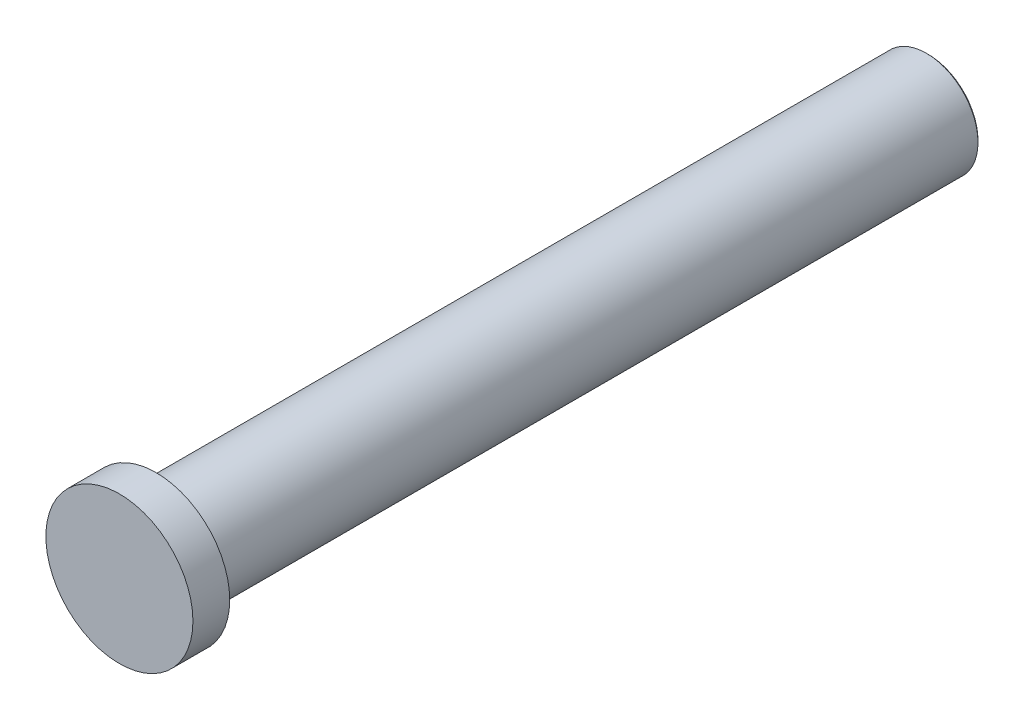
ISO-10303-21;
HEADER;
FILE_DESCRIPTION(('STEP AP214'),'2;1');
FILE_NAME('part.step','',(''),(''),'','','');
FILE_SCHEMA(('AUTOMOTIVE_DESIGN { 1 0 10303 214 1 1 1 1 }'));
ENDSEC;
DATA;
#1=APPLICATION_CONTEXT('core data for automotive mechanical design processes');
#2=APPLICATION_PROTOCOL_DEFINITION('international standard','automotive_design',2000,#1);
#3=PRODUCT_CONTEXT('',#1,'mechanical');
#4=PRODUCT('Part','Part','',(#3));
#5=PRODUCT_RELATED_PRODUCT_CATEGORY('part','',(#4));
#6=PRODUCT_DEFINITION_FORMATION('','',#4);
#7=PRODUCT_DEFINITION_CONTEXT('part definition',#1,'design');
#8=PRODUCT_DEFINITION('design','',#6,#7);
#9=PRODUCT_DEFINITION_SHAPE('','',#8);
#10=(LENGTH_UNIT() NAMED_UNIT(*) SI_UNIT(.MILLI.,.METRE.));
#11=(NAMED_UNIT(*) PLANE_ANGLE_UNIT() SI_UNIT($,.RADIAN.));
#12=(NAMED_UNIT(*) SI_UNIT($,.STERADIAN.) SOLID_ANGLE_UNIT());
#13=UNCERTAINTY_MEASURE_WITH_UNIT(LENGTH_MEASURE(1.E-05),#10,'distance_accuracy_value','');
#14=(GEOMETRIC_REPRESENTATION_CONTEXT(3) GLOBAL_UNCERTAINTY_ASSIGNED_CONTEXT((#13)) GLOBAL_UNIT_ASSIGNED_CONTEXT((#10,
#11,#12)) REPRESENTATION_CONTEXT('',''));
#15=CARTESIAN_POINT('',(0.,0.,0.));
#16=DIRECTION('',(0.,0.,1.));
#17=DIRECTION('',(1.,0.,0.));
#18=AXIS2_PLACEMENT_3D('',#15,#16,#17);
#19=CARTESIAN_POINT('',(0.,0.,21.));
#20=DIRECTION('',(0.,0.,-1.));
#21=DIRECTION('',(-1.,0.,0.));
#22=AXIS2_PLACEMENT_3D('',#19,#20,#21);
#23=CYLINDRICAL_SURFACE('',#22,1.4);
#24=CARTESIAN_POINT('',(0.,0.,20.95));
#25=DIRECTION('',(0.,0.,1.));
#26=DIRECTION('',(1.,0.,0.));
#27=AXIS2_PLACEMENT_3D('',#24,#25,#26);
#28=CIRCLE('',#27,1.4);
#29=CARTESIAN_POINT('',(-1.4,0.,20.95));
#30=VERTEX_POINT('',#29);
#31=EDGE_CURVE('E54',#30,#30,#28,.F.);
#32=CARTESIAN_POINT('',(0.,0.,0.0500000000000153));
#33=DIRECTION('',(0.,0.,1.));
#34=DIRECTION('',(1.,0.,0.));
#35=AXIS2_PLACEMENT_3D('',#32,#33,#34);
#36=CIRCLE('',#35,1.4);
#37=CARTESIAN_POINT('',(-1.4,0.,0.0500000000000153));
#38=VERTEX_POINT('',#37);
#39=EDGE_CURVE('E59',#38,#38,#36,.T.);
#40=CARTESIAN_POINT('',(-1.4,0.,20.95));
#41=CARTESIAN_POINT('',(-1.4,0.,20.7322916666667));
#42=CARTESIAN_POINT('',(-1.4,0.,20.5145833333333));
#43=CARTESIAN_POINT('',(-1.4,0.,20.0791666666667));
#44=CARTESIAN_POINT('',(-1.4,0.,19.8614583333333));
#45=CARTESIAN_POINT('',(-1.4,0.,19.4260416666667));
#46=CARTESIAN_POINT('',(-1.4,0.,19.2083333333333));
#47=CARTESIAN_POINT('',(-1.4,0.,18.7729166666667));
#48=CARTESIAN_POINT('',(-1.4,0.,18.5552083333333));
#49=CARTESIAN_POINT('',(-1.4,0.,18.1197916666667));
#50=CARTESIAN_POINT('',(-1.4,0.,17.9020833333333));
#51=CARTESIAN_POINT('',(-1.4,0.,17.4666666666667));
#52=CARTESIAN_POINT('',(-1.4,0.,17.2489583333333));
#53=CARTESIAN_POINT('',(-1.4,0.,16.8135416666667));
#54=CARTESIAN_POINT('',(-1.4,0.,16.5958333333333));
#55=CARTESIAN_POINT('',(-1.4,0.,16.1604166666667));
#56=CARTESIAN_POINT('',(-1.4,0.,15.9427083333333));
#57=CARTESIAN_POINT('',(-1.4,0.,15.5072916666667));
#58=CARTESIAN_POINT('',(-1.4,0.,15.2895833333333));
#59=CARTESIAN_POINT('',(-1.4,0.,14.8541666666667));
#60=CARTESIAN_POINT('',(-1.4,0.,14.6364583333333));
#61=CARTESIAN_POINT('',(-1.4,0.,14.2010416666667));
#62=CARTESIAN_POINT('',(-1.4,0.,13.9833333333333));
#63=CARTESIAN_POINT('',(-1.4,0.,13.5479166666667));
#64=CARTESIAN_POINT('',(-1.4,0.,13.3302083333333));
#65=CARTESIAN_POINT('',(-1.4,0.,12.8947916666667));
#66=CARTESIAN_POINT('',(-1.4,0.,12.6770833333333));
#67=CARTESIAN_POINT('',(-1.4,0.,12.2416666666667));
#68=CARTESIAN_POINT('',(-1.4,0.,12.0239583333333));
#69=CARTESIAN_POINT('',(-1.4,0.,11.5885416666667));
#70=CARTESIAN_POINT('',(-1.4,0.,11.3708333333333));
#71=CARTESIAN_POINT('',(-1.4,0.,10.9354166666667));
#72=CARTESIAN_POINT('',(-1.4,0.,10.7177083333333));
#73=CARTESIAN_POINT('',(-1.4,0.,10.2822916666667));
#74=CARTESIAN_POINT('',(-1.4,0.,10.0645833333333));
#75=CARTESIAN_POINT('',(-1.4,0.,9.62916666666668));
#76=CARTESIAN_POINT('',(-1.4,0.,9.41145833333334));
#77=CARTESIAN_POINT('',(-1.4,0.,8.97604166666668));
#78=CARTESIAN_POINT('',(-1.4,0.,8.75833333333334));
#79=CARTESIAN_POINT('',(-1.4,0.,8.32291666666668));
#80=CARTESIAN_POINT('',(-1.4,0.,8.10520833333334));
#81=CARTESIAN_POINT('',(-1.4,0.,7.66979166666668));
#82=CARTESIAN_POINT('',(-1.4,0.,7.45208333333334));
#83=CARTESIAN_POINT('',(-1.4,0.,7.01666666666668));
#84=CARTESIAN_POINT('',(-1.4,0.,6.79895833333334));
#85=CARTESIAN_POINT('',(-1.4,0.,6.36354166666668));
#86=CARTESIAN_POINT('',(-1.4,0.,6.14583333333334));
#87=CARTESIAN_POINT('',(-1.4,0.,5.71041666666668));
#88=CARTESIAN_POINT('',(-1.4,0.,5.49270833333335));
#89=CARTESIAN_POINT('',(-1.4,0.,5.05729166666668));
#90=CARTESIAN_POINT('',(-1.4,0.,4.83958333333335));
#91=CARTESIAN_POINT('',(-1.4,0.,4.40416666666668));
#92=CARTESIAN_POINT('',(-1.4,0.,4.18645833333335));
#93=CARTESIAN_POINT('',(-1.4,0.,3.75104166666668));
#94=CARTESIAN_POINT('',(-1.4,0.,3.53333333333334));
#95=CARTESIAN_POINT('',(-1.4,0.,3.09791666666668));
#96=CARTESIAN_POINT('',(-1.4,0.,2.88020833333334));
#97=CARTESIAN_POINT('',(-1.4,0.,2.44479166666668));
#98=CARTESIAN_POINT('',(-1.4,0.,2.22708333333335));
#99=CARTESIAN_POINT('',(-1.4,0.,1.79166666666668));
#100=CARTESIAN_POINT('',(-1.4,0.,1.57395833333334));
#101=CARTESIAN_POINT('',(-1.4,0.,1.13854166666668));
#102=CARTESIAN_POINT('',(-1.4,0.,0.920833333333345));
#103=CARTESIAN_POINT('',(-1.4,0.,0.48541666666668));
#104=CARTESIAN_POINT('',(-1.4,0.,0.267708333333348));
#105=CARTESIAN_POINT('',(-1.4,0.,0.0500000000000153));
#106=B_SPLINE_CURVE_WITH_KNOTS('',3,(#40,#41,#42,#43,#44,#45,#46,#47,#48,#49,#50,#51,#52,#53,
#54,#55,#56,#57,#58,#59,#60,#61,#62,#63,#64,#65,#66,#67,#68,#69,#70,#71,#72,#73,#74,#75,#76,#77,
#78,#79,#80,#81,#82,#83,#84,#85,#86,#87,#88,#89,#90,#91,#92,#93,#94,#95,#96,#97,#98,#99,#100,
#101,#102,#103,#104,#105),.UNSPECIFIED.,.F.,.F.,(4,2,2,2,2,2,2,2,2,2,2,2,2,2,2,2,2,2,2,2,2,2,2,
2,2,2,2,2,2,2,2,2,4),(0.,0.653125000000001,1.30625,1.959375,2.6125,3.265625,3.91875,4.571875,
5.225,5.878125,6.53125,7.184375,7.8375,8.490625,9.14375,9.796875,10.45,11.103125,11.75625,
12.409375,13.0625,13.715625,14.36875,15.021875,15.675,16.328125,16.98125,17.634375,18.2875,
18.940625,19.59375,20.246875,20.9),.UNSPECIFIED.);
#107=EDGE_CURVE('BSEAM45',#30,#38,#106,.T.);
#108=ORIENTED_EDGE('',*,*,#31,.T.);
#109=ORIENTED_EDGE('',*,*,#39,.T.);
#110=ORIENTED_EDGE('',*,*,#107,.T.);
#111=ORIENTED_EDGE('',*,*,#107,.F.);
#112=EDGE_LOOP('',(#108,#110,#109,#111));
#113=FACE_BOUND('',#112,.T.);
#114=ADVANCED_FACE('F45',(#113),#23,.T.);
#115=CARTESIAN_POINT('',(0.,0.,0.));
#116=DIRECTION('',(0.,0.,1.));
#117=DIRECTION('',(1.,0.,0.));
#118=AXIS2_PLACEMENT_3D('',#115,#116,#117);
#119=PLANE('',#118);
#120=CARTESIAN_POINT('',(0.,0.,0.));
#121=DIRECTION('',(0.,0.,1.));
#122=DIRECTION('',(1.,0.,0.));
#123=AXIS2_PLACEMENT_3D('',#120,#121,#122);
#124=CIRCLE('',#123,1.34999999999998);
#125=CARTESIAN_POINT('',(1.34999999999998,0.,0.));
#126=VERTEX_POINT('',#125);
#127=EDGE_CURVE('E10',#126,#126,#124,.F.);
#128=ORIENTED_EDGE('',*,*,#127,.T.);
#129=EDGE_LOOP('',(#128));
#130=FACE_BOUND('',#129,.T.);
#131=ADVANCED_FACE('F96',(#130),#119,.F.);
#132=CARTESIAN_POINT('',(0.,0.,21.));
#133=DIRECTION('',(0.,0.,-1.));
#134=DIRECTION('',(-1.,0.,0.));
#135=AXIS2_PLACEMENT_3D('',#132,#133,#134);
#136=CONICAL_SURFACE('',#135,1.35000000000001,0.785398163397431);
#137=CARTESIAN_POINT('',(0.,0.,21.));
#138=DIRECTION('',(0.,0.,1.));
#139=DIRECTION('',(1.,0.,0.));
#140=AXIS2_PLACEMENT_3D('',#137,#138,#139);
#141=CIRCLE('',#140,1.35000000000001);
#142=CARTESIAN_POINT('',(-1.35000000000001,0.,21.));
#143=VERTEX_POINT('',#142);
#144=EDGE_CURVE('E64',#143,#143,#141,.T.);
#145=CARTESIAN_POINT('',(-1.4,0.,20.95));
#146=CARTESIAN_POINT('',(-1.39947916666667,0.,20.9505208333333));
#147=CARTESIAN_POINT('',(-1.39895833333334,0.,20.9510416666667));
#148=CARTESIAN_POINT('',(-1.39791666666667,0.,20.9520833333333));
#149=CARTESIAN_POINT('',(-1.39739583333334,0.,20.9526041666667));
#150=CARTESIAN_POINT('',(-1.39635416666667,0.,20.9536458333333));
#151=CARTESIAN_POINT('',(-1.39583333333334,0.,20.9541666666667));
#152=CARTESIAN_POINT('',(-1.39479166666667,0.,20.9552083333333));
#153=CARTESIAN_POINT('',(-1.39427083333334,0.,20.9557291666667));
#154=CARTESIAN_POINT('',(-1.39322916666667,0.,20.9567708333333));
#155=CARTESIAN_POINT('',(-1.39270833333334,0.,20.9572916666667));
#156=CARTESIAN_POINT('',(-1.39166666666667,0.,20.9583333333333));
#157=CARTESIAN_POINT('',(-1.39114583333334,0.,20.9588541666667));
#158=CARTESIAN_POINT('',(-1.39010416666667,0.,20.9598958333333));
#159=CARTESIAN_POINT('',(-1.38958333333334,0.,20.9604166666667));
#160=CARTESIAN_POINT('',(-1.38854166666667,0.,20.9614583333333));
#161=CARTESIAN_POINT('',(-1.38802083333334,0.,20.9619791666667));
#162=CARTESIAN_POINT('',(-1.38697916666667,0.,20.9630208333333));
#163=CARTESIAN_POINT('',(-1.38645833333334,0.,20.9635416666667));
#164=CARTESIAN_POINT('',(-1.38541666666667,0.,20.9645833333333));
#165=CARTESIAN_POINT('',(-1.38489583333334,0.,20.9651041666667));
#166=CARTESIAN_POINT('',(-1.38385416666667,0.,20.9661458333333));
#167=CARTESIAN_POINT('',(-1.38333333333334,0.,20.9666666666667));
#168=CARTESIAN_POINT('',(-1.38229166666667,0.,20.9677083333333));
#169=CARTESIAN_POINT('',(-1.38177083333334,0.,20.9682291666667));
#170=CARTESIAN_POINT('',(-1.38072916666667,0.,20.9692708333333));
#171=CARTESIAN_POINT('',(-1.38020833333334,0.,20.9697916666667));
#172=CARTESIAN_POINT('',(-1.37916666666667,0.,20.9708333333333));
#173=CARTESIAN_POINT('',(-1.37864583333334,0.,20.9713541666667));
#174=CARTESIAN_POINT('',(-1.37760416666667,0.,20.9723958333333));
#175=CARTESIAN_POINT('',(-1.37708333333334,0.,20.9729166666667));
#176=CARTESIAN_POINT('',(-1.37604166666667,0.,20.9739583333333));
#177=CARTESIAN_POINT('',(-1.37552083333334,0.,20.9744791666667));
#178=CARTESIAN_POINT('',(-1.37447916666667,0.,20.9755208333333));
#179=CARTESIAN_POINT('',(-1.37395833333334,0.,20.9760416666667));
#180=CARTESIAN_POINT('',(-1.37291666666667,0.,20.9770833333333));
#181=CARTESIAN_POINT('',(-1.37239583333334,0.,20.9776041666667));
#182=CARTESIAN_POINT('',(-1.37135416666667,0.,20.9786458333333));
#183=CARTESIAN_POINT('',(-1.37083333333334,0.,20.9791666666667));
#184=CARTESIAN_POINT('',(-1.36979166666667,0.,20.9802083333333));
#185=CARTESIAN_POINT('',(-1.36927083333334,0.,20.9807291666667));
#186=CARTESIAN_POINT('',(-1.36822916666667,0.,20.9817708333333));
#187=CARTESIAN_POINT('',(-1.36770833333334,0.,20.9822916666667));
#188=CARTESIAN_POINT('',(-1.36666666666667,0.,20.9833333333333));
#189=CARTESIAN_POINT('',(-1.36614583333334,0.,20.9838541666667));
#190=CARTESIAN_POINT('',(-1.36510416666667,0.,20.9848958333333));
#191=CARTESIAN_POINT('',(-1.36458333333334,0.,20.9854166666667));
#192=CARTESIAN_POINT('',(-1.36354166666667,0.,20.9864583333333));
#193=CARTESIAN_POINT('',(-1.36302083333334,0.,20.9869791666667));
#194=CARTESIAN_POINT('',(-1.36197916666667,0.,20.9880208333333));
#195=CARTESIAN_POINT('',(-1.36145833333334,0.,20.9885416666667));
#196=CARTESIAN_POINT('',(-1.36041666666667,0.,20.9895833333333));
#197=CARTESIAN_POINT('',(-1.35989583333334,0.,20.9901041666667));
#198=CARTESIAN_POINT('',(-1.35885416666667,0.,20.9911458333333));
#199=CARTESIAN_POINT('',(-1.35833333333334,0.,20.9916666666667));
#200=CARTESIAN_POINT('',(-1.35729166666667,0.,20.9927083333333));
#201=CARTESIAN_POINT('',(-1.35677083333334,0.,20.9932291666667));
#202=CARTESIAN_POINT('',(-1.35572916666667,0.,20.9942708333333));
#203=CARTESIAN_POINT('',(-1.35520833333334,0.,20.9947916666667));
#204=CARTESIAN_POINT('',(-1.35416666666667,0.,20.9958333333333));
#205=CARTESIAN_POINT('',(-1.35364583333334,0.,20.9963541666667));
#206=CARTESIAN_POINT('',(-1.35260416666668,0.,20.9973958333333));
#207=CARTESIAN_POINT('',(-1.35208333333334,0.,20.9979166666667));
#208=CARTESIAN_POINT('',(-1.35104166666668,0.,20.9989583333333));
#209=CARTESIAN_POINT('',(-1.35052083333334,0.,20.9994791666667));
#210=CARTESIAN_POINT('',(-1.35000000000001,0.,21.));
#211=B_SPLINE_CURVE_WITH_KNOTS('',3,(#145,#146,#147,#148,#149,#150,#151,#152,#153,#154,#155,
#156,#157,#158,#159,#160,#161,#162,#163,#164,#165,#166,#167,#168,#169,#170,#171,#172,#173,#174,
#175,#176,#177,#178,#179,#180,#181,#182,#183,#184,#185,#186,#187,#188,#189,#190,#191,#192,#193,
#194,#195,#196,#197,#198,#199,#200,#201,#202,#203,#204,#205,#206,#207,#208,#209,#210),
.UNSPECIFIED.,.F.,.F.,(4,2,2,2,2,2,2,2,2,2,2,2,2,2,2,2,2,2,2,2,2,2,2,2,2,2,2,2,2,2,2,2,4),(0.,
0.00220970869120772,0.00441941738241528,0.006629126073623,0.00883883476483072,
0.0110485434560384,0.0132582521472462,0.0154679608384537,0.0176776695296614,0.0198873782208692,
0.0220970869120767,0.0243067956032844,0.0265165042944921,0.0287262129856999,0.0309359216769076,
0.0331456303681151,0.0353553390593229,0.0375650477505306,0.0397747564417381,0.0419844651329459,
0.0441941738241536,0.0464038825153613,0.048613591206569,0.0508232998977766,0.0530330085889843,
0.055242717280192,0.0574524259713996,0.0596621346626073,0.061871843353815,0.0640815520450228,
0.0662912607362305,0.0685009694274381,0.0707106781186458),.UNSPECIFIED.);
#212=EDGE_CURVE('BSEAM101',#30,#143,#211,.T.);
#213=ORIENTED_EDGE('',*,*,#31,.F.);
#214=ORIENTED_EDGE('',*,*,#144,.F.);
#215=ORIENTED_EDGE('',*,*,#212,.T.);
#216=ORIENTED_EDGE('',*,*,#212,.F.);
#217=EDGE_LOOP('',(#213,#215,#214,#216));
#218=FACE_BOUND('',#217,.T.);
#219=ADVANCED_FACE('F101',(#218),#136,.T.);
#220=CARTESIAN_POINT('',(0.,0.,0.0500000000000153));
#221=DIRECTION('',(0.,0.,1.));
#222=DIRECTION('',(1.,0.,0.));
#223=AXIS2_PLACEMENT_3D('',#220,#221,#222);
#224=CONICAL_SURFACE('',#223,1.4,0.785398163397448);
#225=ORIENTED_EDGE('',*,*,#127,.F.);
#226=EDGE_LOOP('',(#225));
#227=FACE_BOUND('',#226,.T.);
#228=ORIENTED_EDGE('',*,*,#39,.F.);
#229=EDGE_LOOP('',(#228));
#230=FACE_BOUND('',#229,.T.);
#231=ADVANCED_FACE('F48',(#227,#230),#224,.T.);
#232=CARTESIAN_POINT('',(0.,0.,22.));
#233=DIRECTION('',(0.,0.,-1.));
#234=DIRECTION('',(-1.,0.,0.));
#235=AXIS2_PLACEMENT_3D('',#232,#233,#234);
#236=CYLINDRICAL_SURFACE('',#235,2.);
#237=CARTESIAN_POINT('',(0.,0.,22.));
#238=DIRECTION('',(0.,0.,1.));
#239=DIRECTION('',(1.,0.,0.));
#240=AXIS2_PLACEMENT_3D('',#237,#238,#239);
#241=CIRCLE('',#240,2.);
#242=CARTESIAN_POINT('',(2.,0.,22.));
#243=VERTEX_POINT('',#242);
#244=EDGE_CURVE('E70',#243,#243,#241,.T.);
#245=ORIENTED_EDGE('',*,*,#244,.F.);
#246=EDGE_LOOP('',(#245));
#247=FACE_BOUND('',#246,.T.);
#248=CARTESIAN_POINT('',(0.,0.,21.));
#249=DIRECTION('',(0.,0.,1.));
#250=DIRECTION('',(1.,0.,0.));
#251=AXIS2_PLACEMENT_3D('',#248,#249,#250);
#252=CIRCLE('',#251,2.);
#253=CARTESIAN_POINT('',(2.,0.,21.));
#254=VERTEX_POINT('',#253);
#255=EDGE_CURVE('E71',#254,#254,#252,.T.);
#256=ORIENTED_EDGE('',*,*,#255,.T.);
#257=EDGE_LOOP('',(#256));
#258=FACE_BOUND('',#257,.T.);
#259=ADVANCED_FACE('F81',(#247,#258),#236,.T.);
#260=CARTESIAN_POINT('',(0.,0.,22.));
#261=DIRECTION('',(0.,0.,1.));
#262=DIRECTION('',(1.,0.,0.));
#263=AXIS2_PLACEMENT_3D('',#260,#261,#262);
#264=PLANE('',#263);
#265=ORIENTED_EDGE('',*,*,#244,.T.);
#266=EDGE_LOOP('',(#265));
#267=FACE_BOUND('',#266,.T.);
#268=ADVANCED_FACE('F79',(#267),#264,.T.);
#269=CARTESIAN_POINT('',(0.,0.,21.));
#270=DIRECTION('',(0.,0.,1.));
#271=DIRECTION('',(1.,0.,0.));
#272=AXIS2_PLACEMENT_3D('',#269,#270,#271);
#273=PLANE('',#272);
#274=ORIENTED_EDGE('',*,*,#144,.T.);
#275=EDGE_LOOP('',(#274));
#276=FACE_BOUND('',#275,.T.);
#277=ORIENTED_EDGE('',*,*,#255,.F.);
#278=EDGE_LOOP('',(#277));
#279=FACE_BOUND('',#278,.T.);
#280=ADVANCED_FACE('F87',(#276,#279),#273,.F.);
#281=CLOSED_SHELL('',(#114,#131,#219,#231,#259,#268,#280));
#282=MANIFOLD_SOLID_BREP('B2',#281);
#283=ADVANCED_BREP_SHAPE_REPRESENTATION('',(#18,#282),#14);
#284=SHAPE_DEFINITION_REPRESENTATION(#9,#283);
ENDSEC;
END-ISO-10303-21;
